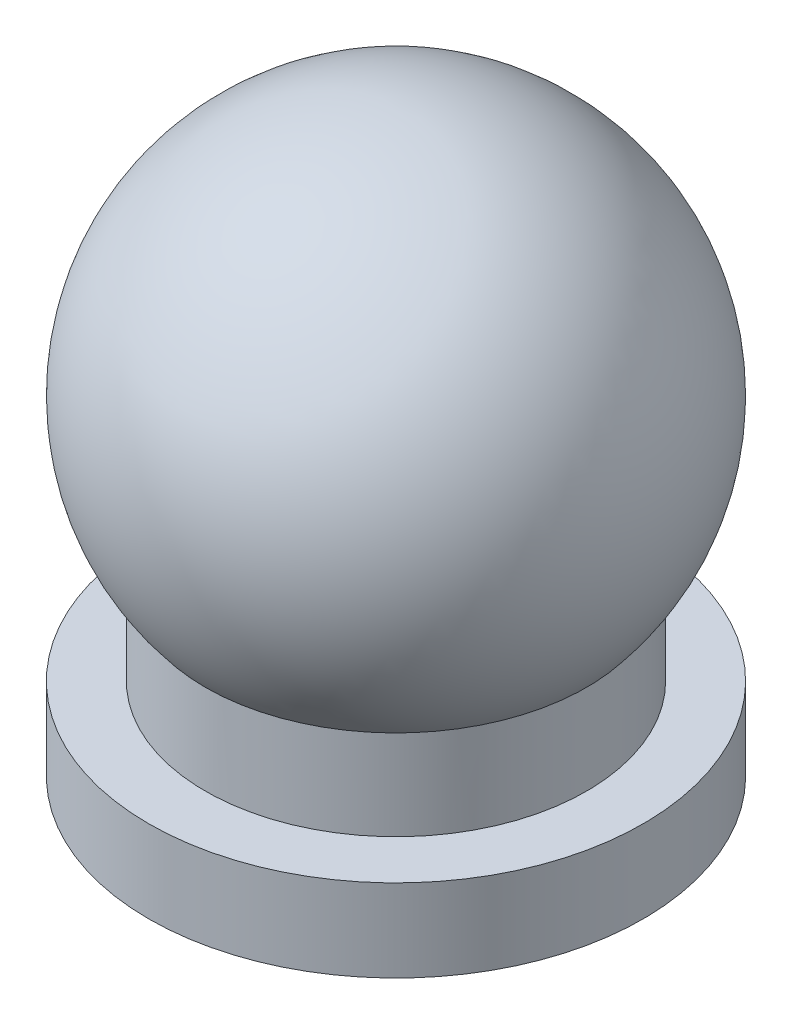
ISO-10303-21;
HEADER;
FILE_DESCRIPTION(('STEP AP214'),'2;1');
FILE_NAME('part.step','',(''),(''),'','','');
FILE_SCHEMA(('AUTOMOTIVE_DESIGN { 1 0 10303 214 1 1 1 1 }'));
ENDSEC;
DATA;
#1=APPLICATION_CONTEXT('core data for automotive mechanical design processes');
#2=APPLICATION_PROTOCOL_DEFINITION('international standard','automotive_design',2000,#1);
#3=PRODUCT_CONTEXT('',#1,'mechanical');
#4=PRODUCT('Part','Part','',(#3));
#5=PRODUCT_RELATED_PRODUCT_CATEGORY('part','',(#4));
#6=PRODUCT_DEFINITION_FORMATION('','',#4);
#7=PRODUCT_DEFINITION_CONTEXT('part definition',#1,'design');
#8=PRODUCT_DEFINITION('design','',#6,#7);
#9=PRODUCT_DEFINITION_SHAPE('','',#8);
#10=(LENGTH_UNIT() NAMED_UNIT(*) SI_UNIT(.MILLI.,.METRE.));
#11=(NAMED_UNIT(*) PLANE_ANGLE_UNIT() SI_UNIT($,.RADIAN.));
#12=(NAMED_UNIT(*) SI_UNIT($,.STERADIAN.) SOLID_ANGLE_UNIT());
#13=UNCERTAINTY_MEASURE_WITH_UNIT(LENGTH_MEASURE(1.E-05),#10,'distance_accuracy_value','');
#14=(GEOMETRIC_REPRESENTATION_CONTEXT(3) GLOBAL_UNCERTAINTY_ASSIGNED_CONTEXT((#13)) GLOBAL_UNIT_ASSIGNED_CONTEXT((#10,
#11,#12)) REPRESENTATION_CONTEXT('',''));
#15=CARTESIAN_POINT('',(0.,0.,0.));
#16=DIRECTION('',(0.,0.,1.));
#17=DIRECTION('',(1.,0.,0.));
#18=AXIS2_PLACEMENT_3D('',#15,#16,#17);
#19=CARTESIAN_POINT('',(0.,1.,0.));
#20=DIRECTION('',(0.,-1.,0.));
#21=DIRECTION('',(0.,0.,-1.));
#22=AXIS2_PLACEMENT_3D('',#19,#20,#21);
#23=CYLINDRICAL_SURFACE('',#22,3.);
#24=CARTESIAN_POINT('',(0.,1.,0.));
#25=DIRECTION('',(0.,1.,0.));
#26=DIRECTION('',(0.,0.,1.));
#27=AXIS2_PLACEMENT_3D('',#24,#25,#26);
#28=CIRCLE('',#27,3.);
#29=CARTESIAN_POINT('',(0.,1.,3.));
#30=VERTEX_POINT('',#29);
#31=EDGE_CURVE('E10',#30,#30,#28,.T.);
#32=ORIENTED_EDGE('',*,*,#31,.F.);
#33=EDGE_LOOP('',(#32));
#34=FACE_BOUND('',#33,.T.);
#35=CARTESIAN_POINT('',(0.,0.,0.));
#36=DIRECTION('',(0.,1.,0.));
#37=DIRECTION('',(0.,0.,1.));
#38=AXIS2_PLACEMENT_3D('',#35,#36,#37);
#39=CIRCLE('',#38,3.);
#40=CARTESIAN_POINT('',(0.,0.,3.));
#41=VERTEX_POINT('',#40);
#42=EDGE_CURVE('E42',#41,#41,#39,.T.);
#43=ORIENTED_EDGE('',*,*,#42,.T.);
#44=EDGE_LOOP('',(#43));
#45=FACE_BOUND('',#44,.T.);
#46=ADVANCED_FACE('F39',(#34,#45),#23,.T.);
#47=CARTESIAN_POINT('',(0.,1.,0.));
#48=DIRECTION('',(0.,1.,0.));
#49=DIRECTION('',(0.,0.,1.));
#50=AXIS2_PLACEMENT_3D('',#47,#48,#49);
#51=PLANE('',#50);
#52=CARTESIAN_POINT('',(0.,1.,0.));
#53=DIRECTION('',(0.,-1.,0.));
#54=DIRECTION('',(0.,0.,-1.));
#55=AXIS2_PLACEMENT_3D('',#52,#53,#54);
#56=CIRCLE('',#55,2.31383963844184);
#57=CARTESIAN_POINT('',(0.,1.,-2.31383963844184));
#58=VERTEX_POINT('',#57);
#59=EDGE_CURVE('E56',#58,#58,#56,.T.);
#60=ORIENTED_EDGE('',*,*,#59,.T.);
#61=EDGE_LOOP('',(#60));
#62=FACE_BOUND('',#61,.T.);
#63=ORIENTED_EDGE('',*,*,#31,.T.);
#64=EDGE_LOOP('',(#63));
#65=FACE_BOUND('',#64,.T.);
#66=ADVANCED_FACE('F82',(#62,#65),#51,.T.);
#67=CARTESIAN_POINT('',(0.,0.,0.));
#68=DIRECTION('',(0.,1.,0.));
#69=DIRECTION('',(0.,0.,1.));
#70=AXIS2_PLACEMENT_3D('',#67,#68,#69);
#71=PLANE('',#70);
#72=CARTESIAN_POINT('',(0.,0.,0.));
#73=DIRECTION('',(0.,-1.,0.));
#74=DIRECTION('',(0.,0.,-1.));
#75=AXIS2_PLACEMENT_3D('',#72,#73,#74);
#76=CIRCLE('',#75,0.975);
#77=CARTESIAN_POINT('',(0.,0.,-0.975));
#78=VERTEX_POINT('',#77);
#79=EDGE_CURVE('E61',#78,#78,#76,.T.);
#80=ORIENTED_EDGE('',*,*,#79,.F.);
#81=EDGE_LOOP('',(#80));
#82=FACE_BOUND('',#81,.T.);
#83=ORIENTED_EDGE('',*,*,#42,.F.);
#84=EDGE_LOOP('',(#83));
#85=FACE_BOUND('',#84,.T.);
#86=ADVANCED_FACE('F78',(#82,#85),#71,.F.);
#87=CARTESIAN_POINT('',(0.,4.,0.));
#88=DIRECTION('',(0.,-1.,0.));
#89=DIRECTION('',(0.,0.,1.));
#90=AXIS2_PLACEMENT_3D('',#87,#88,#89);
#91=SPHERICAL_SURFACE('',#90,3.);
#92=CARTESIAN_POINT('',(0.,2.09051155343235,0.));
#93=DIRECTION('',(0.,-1.,0.));
#94=DIRECTION('',(0.,0.,-1.));
#95=AXIS2_PLACEMENT_3D('',#92,#93,#94);
#96=CIRCLE('',#95,2.31383963844184);
#97=CARTESIAN_POINT('',(0.,2.09051155343235,-2.31383963844184));
#98=VERTEX_POINT('',#97);
#99=EDGE_CURVE('E51',#98,#98,#96,.T.);
#100=ORIENTED_EDGE('',*,*,#99,.F.);
#101=EDGE_LOOP('',(#100));
#102=FACE_BOUND('',#101,.T.);
#103=ADVANCED_FACE('F81',(#102),#91,.T.);
#104=CARTESIAN_POINT('',(0.,4.,0.));
#105=DIRECTION('',(0.,-1.,0.));
#106=DIRECTION('',(0.,0.,-1.));
#107=AXIS2_PLACEMENT_3D('',#104,#105,#106);
#108=CYLINDRICAL_SURFACE('',#107,2.31383963844184);
#109=ORIENTED_EDGE('',*,*,#59,.F.);
#110=EDGE_LOOP('',(#109));
#111=FACE_BOUND('',#110,.T.);
#112=ORIENTED_EDGE('',*,*,#99,.T.);
#113=EDGE_LOOP('',(#112));
#114=FACE_BOUND('',#113,.T.);
#115=ADVANCED_FACE('F74',(#111,#114),#108,.T.);
#116=CARTESIAN_POINT('',(0.,5.5,0.));
#117=DIRECTION('',(0.,-1.,0.));
#118=DIRECTION('',(0.,0.,-1.));
#119=AXIS2_PLACEMENT_3D('',#116,#117,#118);
#120=CYLINDRICAL_SURFACE('',#119,0.975);
#121=CARTESIAN_POINT('',(0.,5.5,0.));
#122=DIRECTION('',(0.,-1.,0.));
#123=DIRECTION('',(0.,0.,-1.));
#124=AXIS2_PLACEMENT_3D('',#121,#122,#123);
#125=CIRCLE('',#124,0.975);
#126=CARTESIAN_POINT('',(0.,5.5,-0.975));
#127=VERTEX_POINT('',#126);
#128=EDGE_CURVE('E60',#127,#127,#125,.T.);
#129=ORIENTED_EDGE('',*,*,#128,.F.);
#130=EDGE_LOOP('',(#129));
#131=FACE_BOUND('',#130,.T.);
#132=ORIENTED_EDGE('',*,*,#79,.T.);
#133=EDGE_LOOP('',(#132));
#134=FACE_BOUND('',#133,.T.);
#135=ADVANCED_FACE('F71',(#131,#134),#120,.F.);
#136=CARTESIAN_POINT('',(0.,5.5,0.));
#137=DIRECTION('',(0.,-1.,0.));
#138=DIRECTION('',(0.,0.,-1.));
#139=AXIS2_PLACEMENT_3D('',#136,#137,#138);
#140=PLANE('',#139);
#141=ORIENTED_EDGE('',*,*,#128,.T.);
#142=EDGE_LOOP('',(#141));
#143=FACE_BOUND('',#142,.T.);
#144=ADVANCED_FACE('F69',(#143),#140,.T.);
#145=CLOSED_SHELL('',(#46,#66,#86,#103,#115,#135,#144));
#146=MANIFOLD_SOLID_BREP('B2',#145);
#147=ADVANCED_BREP_SHAPE_REPRESENTATION('',(#18,#146),#14);
#148=SHAPE_DEFINITION_REPRESENTATION(#9,#147);
ENDSEC;
END-ISO-10303-21;
